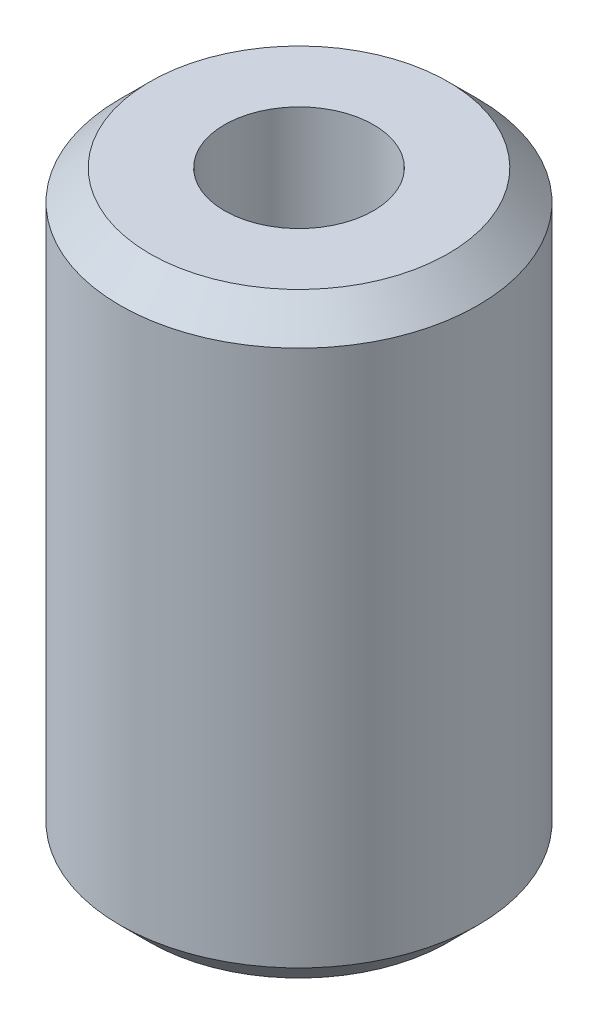
ISO-10303-21;
HEADER;
FILE_DESCRIPTION(('STEP AP214'),'2;1');
FILE_NAME('part.step','',(''),(''),'','','');
FILE_SCHEMA(('AUTOMOTIVE_DESIGN { 1 0 10303 214 1 1 1 1 }'));
ENDSEC;
DATA;
#1=APPLICATION_CONTEXT('core data for automotive mechanical design processes');
#2=APPLICATION_PROTOCOL_DEFINITION('international standard','automotive_design',2000,#1);
#3=PRODUCT_CONTEXT('',#1,'mechanical');
#4=PRODUCT('Part','Part','',(#3));
#5=PRODUCT_RELATED_PRODUCT_CATEGORY('part','',(#4));
#6=PRODUCT_DEFINITION_FORMATION('','',#4);
#7=PRODUCT_DEFINITION_CONTEXT('part definition',#1,'design');
#8=PRODUCT_DEFINITION('design','',#6,#7);
#9=PRODUCT_DEFINITION_SHAPE('','',#8);
#10=(LENGTH_UNIT() NAMED_UNIT(*) SI_UNIT(.MILLI.,.METRE.));
#11=(NAMED_UNIT(*) PLANE_ANGLE_UNIT() SI_UNIT($,.RADIAN.));
#12=(NAMED_UNIT(*) SI_UNIT($,.STERADIAN.) SOLID_ANGLE_UNIT());
#13=UNCERTAINTY_MEASURE_WITH_UNIT(LENGTH_MEASURE(1.E-05),#10,'distance_accuracy_value','');
#14=(GEOMETRIC_REPRESENTATION_CONTEXT(3) GLOBAL_UNCERTAINTY_ASSIGNED_CONTEXT((#13)) GLOBAL_UNIT_ASSIGNED_CONTEXT((#10,
#11,#12)) REPRESENTATION_CONTEXT('',''));
#15=CARTESIAN_POINT('',(0.,0.,0.));
#16=DIRECTION('',(0.,0.,1.));
#17=DIRECTION('',(1.,0.,0.));
#18=AXIS2_PLACEMENT_3D('',#15,#16,#17);
#19=CARTESIAN_POINT('',(0.,10.,0.));
#20=DIRECTION('',(0.,-1.,0.));
#21=DIRECTION('',(0.,0.,-1.));
#22=AXIS2_PLACEMENT_3D('',#19,#20,#21);
#23=CYLINDRICAL_SURFACE('',#22,3.);
#24=CARTESIAN_POINT('',(0.,0.499999999999999,0.));
#25=DIRECTION('',(0.,1.,0.));
#26=DIRECTION('',(0.,0.,1.));
#27=AXIS2_PLACEMENT_3D('',#24,#25,#26);
#28=CIRCLE('',#27,3.);
#29=CARTESIAN_POINT('',(0.,0.499999999999999,3.));
#30=VERTEX_POINT('',#29);
#31=EDGE_CURVE('E51',#30,#30,#28,.T.);
#32=ORIENTED_EDGE('',*,*,#31,.T.);
#33=EDGE_LOOP('',(#32));
#34=FACE_BOUND('',#33,.T.);
#35=CARTESIAN_POINT('',(0.,9.5,0.));
#36=DIRECTION('',(0.,1.,0.));
#37=DIRECTION('',(0.,0.,1.));
#38=AXIS2_PLACEMENT_3D('',#35,#36,#37);
#39=CIRCLE('',#38,3.);
#40=CARTESIAN_POINT('',(0.,9.5,3.));
#41=VERTEX_POINT('',#40);
#42=EDGE_CURVE('E55',#41,#41,#39,.F.);
#43=ORIENTED_EDGE('',*,*,#42,.T.);
#44=EDGE_LOOP('',(#43));
#45=FACE_BOUND('',#44,.T.);
#46=ADVANCED_FACE('F39',(#34,#45),#23,.T.);
#47=CARTESIAN_POINT('',(0.,10.,0.));
#48=DIRECTION('',(0.,1.,0.));
#49=DIRECTION('',(0.,0.,1.));
#50=AXIS2_PLACEMENT_3D('',#47,#48,#49);
#51=PLANE('',#50);
#52=CARTESIAN_POINT('',(0.,10.,0.));
#53=DIRECTION('',(0.,1.,0.));
#54=DIRECTION('',(0.,0.,1.));
#55=AXIS2_PLACEMENT_3D('',#52,#53,#54);
#56=CIRCLE('',#55,2.5);
#57=CARTESIAN_POINT('',(0.,10.,2.5));
#58=VERTEX_POINT('',#57);
#59=EDGE_CURVE('E10',#58,#58,#56,.T.);
#60=ORIENTED_EDGE('',*,*,#59,.T.);
#61=EDGE_LOOP('',(#60));
#62=FACE_BOUND('',#61,.T.);
#63=CARTESIAN_POINT('',(0.,10.,0.));
#64=DIRECTION('',(0.,1.,0.));
#65=DIRECTION('',(0.,0.,1.));
#66=AXIS2_PLACEMENT_3D('',#63,#64,#65);
#67=CIRCLE('',#66,1.25);
#68=CARTESIAN_POINT('',(0.,10.,1.25));
#69=VERTEX_POINT('',#68);
#70=EDGE_CURVE('E63',#69,#69,#67,.T.);
#71=ORIENTED_EDGE('',*,*,#70,.F.);
#72=EDGE_LOOP('',(#71));
#73=FACE_BOUND('',#72,.T.);
#74=ADVANCED_FACE('F69',(#62,#73),#51,.T.);
#75=CARTESIAN_POINT('',(0.,0.,0.));
#76=DIRECTION('',(0.,1.,0.));
#77=DIRECTION('',(0.,0.,1.));
#78=AXIS2_PLACEMENT_3D('',#75,#76,#77);
#79=PLANE('',#78);
#80=CARTESIAN_POINT('',(0.,0.,0.));
#81=DIRECTION('',(0.,1.,0.));
#82=DIRECTION('',(0.,0.,1.));
#83=AXIS2_PLACEMENT_3D('',#80,#81,#82);
#84=CIRCLE('',#83,2.5);
#85=CARTESIAN_POINT('',(0.,0.,2.5));
#86=VERTEX_POINT('',#85);
#87=EDGE_CURVE('E47',#86,#86,#84,.F.);
#88=ORIENTED_EDGE('',*,*,#87,.T.);
#89=EDGE_LOOP('',(#88));
#90=FACE_BOUND('',#89,.T.);
#91=CARTESIAN_POINT('',(0.,0.,0.));
#92=DIRECTION('',(0.,1.,0.));
#93=DIRECTION('',(0.,0.,1.));
#94=AXIS2_PLACEMENT_3D('',#91,#92,#93);
#95=CIRCLE('',#94,1.25);
#96=CARTESIAN_POINT('',(0.,0.,1.25));
#97=VERTEX_POINT('',#96);
#98=EDGE_CURVE('E60',#97,#97,#95,.T.);
#99=ORIENTED_EDGE('',*,*,#98,.T.);
#100=EDGE_LOOP('',(#99));
#101=FACE_BOUND('',#100,.T.);
#102=ADVANCED_FACE('F71',(#90,#101),#79,.F.);
#103=CARTESIAN_POINT('',(0.,10.,0.));
#104=DIRECTION('',(0.,1.,0.));
#105=DIRECTION('',(0.,0.,1.));
#106=AXIS2_PLACEMENT_3D('',#103,#104,#105);
#107=CYLINDRICAL_SURFACE('',#106,1.25);
#108=ORIENTED_EDGE('',*,*,#98,.F.);
#109=EDGE_LOOP('',(#108));
#110=FACE_BOUND('',#109,.T.);
#111=ORIENTED_EDGE('',*,*,#70,.T.);
#112=EDGE_LOOP('',(#111));
#113=FACE_BOUND('',#112,.T.);
#114=ADVANCED_FACE('F67',(#110,#113),#107,.F.);
#115=CARTESIAN_POINT('',(0.,0.499999999999999,0.));
#116=DIRECTION('',(0.,1.,0.));
#117=DIRECTION('',(0.,0.,1.));
#118=AXIS2_PLACEMENT_3D('',#115,#116,#117);
#119=CONICAL_SURFACE('',#118,3.,0.785398163397451);
#120=ORIENTED_EDGE('',*,*,#87,.F.);
#121=EDGE_LOOP('',(#120));
#122=FACE_BOUND('',#121,.T.);
#123=ORIENTED_EDGE('',*,*,#31,.F.);
#124=EDGE_LOOP('',(#123));
#125=FACE_BOUND('',#124,.T.);
#126=ADVANCED_FACE('F82',(#122,#125),#119,.T.);
#127=CARTESIAN_POINT('',(0.,10.,0.));
#128=DIRECTION('',(0.,-1.,0.));
#129=DIRECTION('',(0.,0.,-1.));
#130=AXIS2_PLACEMENT_3D('',#127,#128,#129);
#131=CONICAL_SURFACE('',#130,2.5,0.785398163397448);
#132=ORIENTED_EDGE('',*,*,#42,.F.);
#133=EDGE_LOOP('',(#132));
#134=FACE_BOUND('',#133,.T.);
#135=ORIENTED_EDGE('',*,*,#59,.F.);
#136=EDGE_LOOP('',(#135));
#137=FACE_BOUND('',#136,.T.);
#138=ADVANCED_FACE('F42',(#134,#137),#131,.T.);
#139=CLOSED_SHELL('',(#46,#74,#102,#114,#126,#138));
#140=MANIFOLD_SOLID_BREP('B2',#139);
#141=ADVANCED_BREP_SHAPE_REPRESENTATION('',(#18,#140),#14);
#142=SHAPE_DEFINITION_REPRESENTATION(#9,#141);
ENDSEC;
END-ISO-10303-21;
